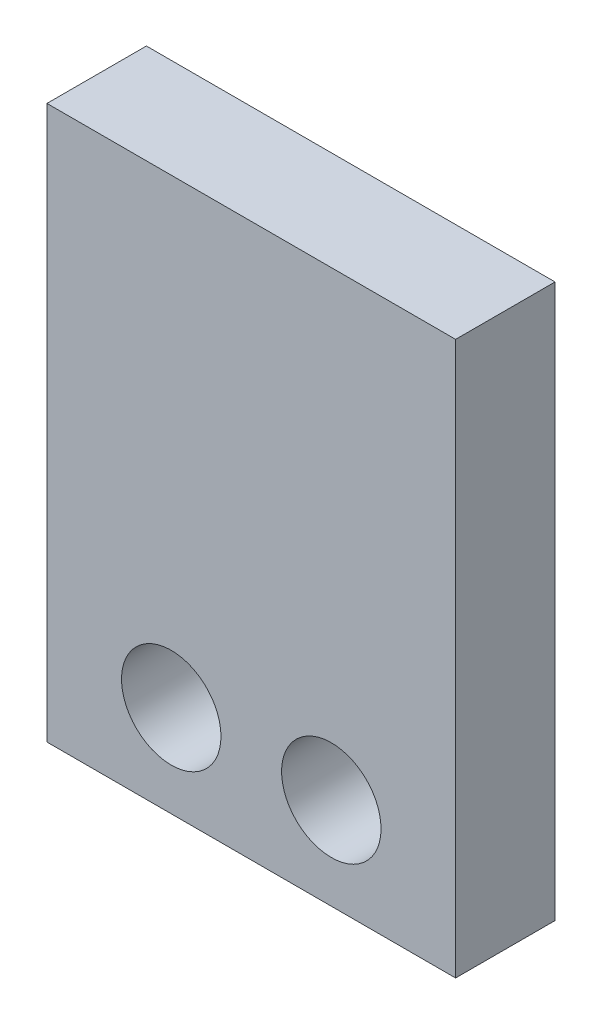
ISO-10303-21;
HEADER;
FILE_DESCRIPTION(('STEP AP214'),'2;1');
FILE_NAME('part.step','',(''),(''),'','','');
FILE_SCHEMA(('AUTOMOTIVE_DESIGN { 1 0 10303 214 1 1 1 1 }'));
ENDSEC;
DATA;
#1=APPLICATION_CONTEXT('core data for automotive mechanical design processes');
#2=APPLICATION_PROTOCOL_DEFINITION('international standard','automotive_design',2000,#1);
#3=PRODUCT_CONTEXT('',#1,'mechanical');
#4=PRODUCT('Part','Part','',(#3));
#5=PRODUCT_RELATED_PRODUCT_CATEGORY('part','',(#4));
#6=PRODUCT_DEFINITION_FORMATION('','',#4);
#7=PRODUCT_DEFINITION_CONTEXT('part definition',#1,'design');
#8=PRODUCT_DEFINITION('design','',#6,#7);
#9=PRODUCT_DEFINITION_SHAPE('','',#8);
#10=(LENGTH_UNIT() NAMED_UNIT(*) SI_UNIT(.MILLI.,.METRE.));
#11=(NAMED_UNIT(*) PLANE_ANGLE_UNIT() SI_UNIT($,.RADIAN.));
#12=(NAMED_UNIT(*) SI_UNIT($,.STERADIAN.) SOLID_ANGLE_UNIT());
#13=UNCERTAINTY_MEASURE_WITH_UNIT(LENGTH_MEASURE(1.E-05),#10,'distance_accuracy_value','');
#14=(GEOMETRIC_REPRESENTATION_CONTEXT(3) GLOBAL_UNCERTAINTY_ASSIGNED_CONTEXT((#13)) GLOBAL_UNIT_ASSIGNED_CONTEXT((#10,
#11,#12)) REPRESENTATION_CONTEXT('',''));
#15=CARTESIAN_POINT('',(0.,0.,0.));
#16=DIRECTION('',(0.,0.,1.));
#17=DIRECTION('',(1.,0.,0.));
#18=AXIS2_PLACEMENT_3D('',#15,#16,#17);
#19=CARTESIAN_POINT('',(-585.239829198075,0.,20.));
#20=DIRECTION('',(-1.,0.,0.));
#21=DIRECTION('',(0.,0.,1.));
#22=AXIS2_PLACEMENT_3D('',#19,#20,#21);
#23=PLANE('',#22);
#24=DIRECTION('',(0.,1.,0.));
#25=VECTOR('',#24,1.);
#26=CARTESIAN_POINT('',(-585.239829198075,0.,0.));
#27=LINE('',#26,#25);
#28=CARTESIAN_POINT('',(-585.239829198075,-18.4851830274408,0.));
#29=VERTEX_POINT('',#28);
#30=CARTESIAN_POINT('',(-585.239829198075,92.7624336185932,0.));
#31=VERTEX_POINT('',#30);
#32=EDGE_CURVE('E103',#29,#31,#27,.T.);
#33=ORIENTED_EDGE('',*,*,#32,.F.);
#34=DIRECTION('',(0.,0.,-1.));
#35=VECTOR('',#34,1.);
#36=CARTESIAN_POINT('',(-585.239829198075,-18.4851830274408,20.));
#37=LINE('',#36,#35);
#38=CARTESIAN_POINT('',(-585.239829198075,-18.4851830274408,20.));
#39=VERTEX_POINT('',#38);
#40=EDGE_CURVE('E11',#39,#29,#37,.T.);
#41=ORIENTED_EDGE('',*,*,#40,.F.);
#42=DIRECTION('',(0.,1.,0.));
#43=VECTOR('',#42,1.);
#44=CARTESIAN_POINT('',(-585.239829198075,0.,20.));
#45=LINE('',#44,#43);
#46=CARTESIAN_POINT('',(-585.239829198075,92.7624336185932,20.));
#47=VERTEX_POINT('',#46);
#48=EDGE_CURVE('E89',#39,#47,#45,.T.);
#49=ORIENTED_EDGE('',*,*,#48,.T.);
#50=DIRECTION('',(0.,0.,-1.));
#51=VECTOR('',#50,1.);
#52=CARTESIAN_POINT('',(-585.239829198075,92.7624336185932,20.));
#53=LINE('',#52,#51);
#54=EDGE_CURVE('E50',#47,#31,#53,.T.);
#55=ORIENTED_EDGE('',*,*,#54,.T.);
#56=EDGE_LOOP('',(#33,#41,#49,#55));
#57=FACE_BOUND('',#56,.T.);
#58=ADVANCED_FACE('F33',(#57),#23,.T.);
#59=CARTESIAN_POINT('',(0.,-18.4851830274408,20.));
#60=DIRECTION('',(0.,-1.,0.));
#61=DIRECTION('',(0.,0.,-1.));
#62=AXIS2_PLACEMENT_3D('',#59,#60,#61);
#63=PLANE('',#62);
#64=DIRECTION('',(-1.,0.,0.));
#65=VECTOR('',#64,1.);
#66=CARTESIAN_POINT('',(0.,-18.4851830274408,0.));
#67=LINE('',#66,#65);
#68=CARTESIAN_POINT('',(-503.044137918202,-18.4851830274408,0.));
#69=VERTEX_POINT('',#68);
#70=EDGE_CURVE('E80',#69,#29,#67,.T.);
#71=ORIENTED_EDGE('',*,*,#70,.F.);
#72=DIRECTION('',(0.,0.,-1.));
#73=VECTOR('',#72,1.);
#74=CARTESIAN_POINT('',(-503.044137918202,-18.4851830274408,20.));
#75=LINE('',#74,#73);
#76=CARTESIAN_POINT('',(-503.044137918202,-18.4851830274408,20.));
#77=VERTEX_POINT('',#76);
#78=EDGE_CURVE('E42',#77,#69,#75,.T.);
#79=ORIENTED_EDGE('',*,*,#78,.F.);
#80=DIRECTION('',(-1.,0.,0.));
#81=VECTOR('',#80,1.);
#82=CARTESIAN_POINT('',(0.,-18.4851830274408,20.));
#83=LINE('',#82,#81);
#84=EDGE_CURVE('E78',#77,#39,#83,.T.);
#85=ORIENTED_EDGE('',*,*,#84,.T.);
#86=ORIENTED_EDGE('',*,*,#40,.T.);
#87=EDGE_LOOP('',(#71,#79,#85,#86));
#88=FACE_BOUND('',#87,.T.);
#89=ADVANCED_FACE('F77',(#88),#63,.T.);
#90=CARTESIAN_POINT('',(-503.044137918202,0.,20.));
#91=DIRECTION('',(1.,0.,0.));
#92=DIRECTION('',(0.,0.,-1.));
#93=AXIS2_PLACEMENT_3D('',#90,#91,#92);
#94=PLANE('',#93);
#95=DIRECTION('',(0.,-1.,0.));
#96=VECTOR('',#95,1.);
#97=CARTESIAN_POINT('',(-503.044137918202,0.,0.));
#98=LINE('',#97,#96);
#99=CARTESIAN_POINT('',(-503.044137918202,92.7624336185932,0.));
#100=VERTEX_POINT('',#99);
#101=EDGE_CURVE('E106',#100,#69,#98,.T.);
#102=ORIENTED_EDGE('',*,*,#101,.F.);
#103=DIRECTION('',(0.,0.,-1.));
#104=VECTOR('',#103,1.);
#105=CARTESIAN_POINT('',(-503.044137918202,92.7624336185932,20.));
#106=LINE('',#105,#104);
#107=CARTESIAN_POINT('',(-503.044137918202,92.7624336185932,20.));
#108=VERTEX_POINT('',#107);
#109=EDGE_CURVE('E63',#108,#100,#106,.T.);
#110=ORIENTED_EDGE('',*,*,#109,.F.);
#111=DIRECTION('',(0.,-1.,0.));
#112=VECTOR('',#111,1.);
#113=CARTESIAN_POINT('',(-503.044137918202,0.,20.));
#114=LINE('',#113,#112);
#115=EDGE_CURVE('E88',#108,#77,#114,.T.);
#116=ORIENTED_EDGE('',*,*,#115,.T.);
#117=ORIENTED_EDGE('',*,*,#78,.T.);
#118=EDGE_LOOP('',(#102,#110,#116,#117));
#119=FACE_BOUND('',#118,.T.);
#120=ADVANCED_FACE('F91',(#119),#94,.T.);
#121=CARTESIAN_POINT('',(-560.239829198075,0.,20.));
#122=DIRECTION('',(0.,0.,-1.));
#123=DIRECTION('',(-1.,0.,0.));
#124=AXIS2_PLACEMENT_3D('',#121,#122,#123);
#125=CYLINDRICAL_SURFACE('',#124,9.99999999999998);
#126=CARTESIAN_POINT('',(-560.239829198075,0.,20.));
#127=DIRECTION('',(0.,0.,1.));
#128=DIRECTION('',(1.,0.,0.));
#129=AXIS2_PLACEMENT_3D('',#126,#127,#128);
#130=CIRCLE('',#129,9.99999999999998);
#131=CARTESIAN_POINT('',(-550.239829198074,0.,20.));
#132=VERTEX_POINT('',#131);
#133=EDGE_CURVE('E115',#132,#132,#130,.T.);
#134=ORIENTED_EDGE('',*,*,#133,.T.);
#135=EDGE_LOOP('',(#134));
#136=FACE_BOUND('',#135,.T.);
#137=CARTESIAN_POINT('',(-560.239829198075,0.,0.));
#138=DIRECTION('',(0.,0.,1.));
#139=DIRECTION('',(1.,0.,0.));
#140=AXIS2_PLACEMENT_3D('',#137,#138,#139);
#141=CIRCLE('',#140,9.99999999999998);
#142=CARTESIAN_POINT('',(-550.239829198074,0.,0.));
#143=VERTEX_POINT('',#142);
#144=EDGE_CURVE('E100',#143,#143,#141,.T.);
#145=ORIENTED_EDGE('',*,*,#144,.F.);
#146=EDGE_LOOP('',(#145));
#147=FACE_BOUND('',#146,.T.);
#148=ADVANCED_FACE('F131',(#136,#147),#125,.F.);
#149=CARTESIAN_POINT('',(-528.044137918202,0.,20.));
#150=DIRECTION('',(0.,0.,-1.));
#151=DIRECTION('',(-1.,0.,0.));
#152=AXIS2_PLACEMENT_3D('',#149,#150,#151);
#153=CYLINDRICAL_SURFACE('',#152,9.99999999999998);
#154=CARTESIAN_POINT('',(-528.044137918202,0.,20.));
#155=DIRECTION('',(0.,0.,1.));
#156=DIRECTION('',(1.,0.,0.));
#157=AXIS2_PLACEMENT_3D('',#154,#155,#156);
#158=CIRCLE('',#157,9.99999999999998);
#159=CARTESIAN_POINT('',(-518.044137918202,0.,20.));
#160=VERTEX_POINT('',#159);
#161=EDGE_CURVE('E111',#160,#160,#158,.T.);
#162=ORIENTED_EDGE('',*,*,#161,.T.);
#163=EDGE_LOOP('',(#162));
#164=FACE_BOUND('',#163,.T.);
#165=CARTESIAN_POINT('',(-528.044137918202,0.,0.));
#166=DIRECTION('',(0.,0.,1.));
#167=DIRECTION('',(1.,0.,0.));
#168=AXIS2_PLACEMENT_3D('',#165,#166,#167);
#169=CIRCLE('',#168,9.99999999999998);
#170=CARTESIAN_POINT('',(-518.044137918202,0.,0.));
#171=VERTEX_POINT('',#170);
#172=EDGE_CURVE('E97',#171,#171,#169,.T.);
#173=ORIENTED_EDGE('',*,*,#172,.F.);
#174=EDGE_LOOP('',(#173));
#175=FACE_BOUND('',#174,.T.);
#176=ADVANCED_FACE('F35',(#164,#175),#153,.F.);
#177=CARTESIAN_POINT('',(0.,92.7624336185932,20.));
#178=DIRECTION('',(0.,1.,0.));
#179=DIRECTION('',(0.,0.,1.));
#180=AXIS2_PLACEMENT_3D('',#177,#178,#179);
#181=PLANE('',#180);
#182=DIRECTION('',(1.,0.,0.));
#183=VECTOR('',#182,1.);
#184=CARTESIAN_POINT('',(0.,92.7624336185932,0.));
#185=LINE('',#184,#183);
#186=EDGE_CURVE('E108',#31,#100,#185,.T.);
#187=ORIENTED_EDGE('',*,*,#186,.F.);
#188=ORIENTED_EDGE('',*,*,#54,.F.);
#189=DIRECTION('',(1.,0.,0.));
#190=VECTOR('',#189,1.);
#191=CARTESIAN_POINT('',(0.,92.7624336185932,20.));
#192=LINE('',#191,#190);
#193=EDGE_CURVE('E92',#47,#108,#192,.T.);
#194=ORIENTED_EDGE('',*,*,#193,.T.);
#195=ORIENTED_EDGE('',*,*,#109,.T.);
#196=EDGE_LOOP('',(#187,#188,#194,#195));
#197=FACE_BOUND('',#196,.T.);
#198=ADVANCED_FACE('F121',(#197),#181,.T.);
#199=CARTESIAN_POINT('',(0.,0.,20.));
#200=DIRECTION('',(0.,0.,1.));
#201=DIRECTION('',(1.,0.,0.));
#202=AXIS2_PLACEMENT_3D('',#199,#200,#201);
#203=PLANE('',#202);
#204=ORIENTED_EDGE('',*,*,#161,.F.);
#205=EDGE_LOOP('',(#204));
#206=FACE_BOUND('',#205,.T.);
#207=ORIENTED_EDGE('',*,*,#133,.F.);
#208=EDGE_LOOP('',(#207));
#209=FACE_BOUND('',#208,.T.);
#210=ORIENTED_EDGE('',*,*,#48,.F.);
#211=ORIENTED_EDGE('',*,*,#84,.F.);
#212=ORIENTED_EDGE('',*,*,#115,.F.);
#213=ORIENTED_EDGE('',*,*,#193,.F.);
#214=EDGE_LOOP('',(#210,#211,#212,#213));
#215=FACE_BOUND('',#214,.T.);
#216=ADVANCED_FACE('F86',(#206,#209,#215),#203,.T.);
#217=CARTESIAN_POINT('',(0.,0.,0.));
#218=DIRECTION('',(0.,0.,1.));
#219=DIRECTION('',(1.,0.,0.));
#220=AXIS2_PLACEMENT_3D('',#217,#218,#219);
#221=PLANE('',#220);
#222=ORIENTED_EDGE('',*,*,#172,.T.);
#223=EDGE_LOOP('',(#222));
#224=FACE_BOUND('',#223,.T.);
#225=ORIENTED_EDGE('',*,*,#144,.T.);
#226=EDGE_LOOP('',(#225));
#227=FACE_BOUND('',#226,.T.);
#228=ORIENTED_EDGE('',*,*,#32,.T.);
#229=ORIENTED_EDGE('',*,*,#186,.T.);
#230=ORIENTED_EDGE('',*,*,#101,.T.);
#231=ORIENTED_EDGE('',*,*,#70,.T.);
#232=EDGE_LOOP('',(#228,#229,#230,#231));
#233=FACE_BOUND('',#232,.T.);
#234=ADVANCED_FACE('F128',(#224,#227,#233),#221,.F.);
#235=CLOSED_SHELL('',(#58,#89,#120,#148,#176,#198,#216,#234));
#236=MANIFOLD_SOLID_BREP('B2',#235);
#237=ADVANCED_BREP_SHAPE_REPRESENTATION('',(#18,#236),#14);
#238=SHAPE_DEFINITION_REPRESENTATION(#9,#237);
ENDSEC;
END-ISO-10303-21;
